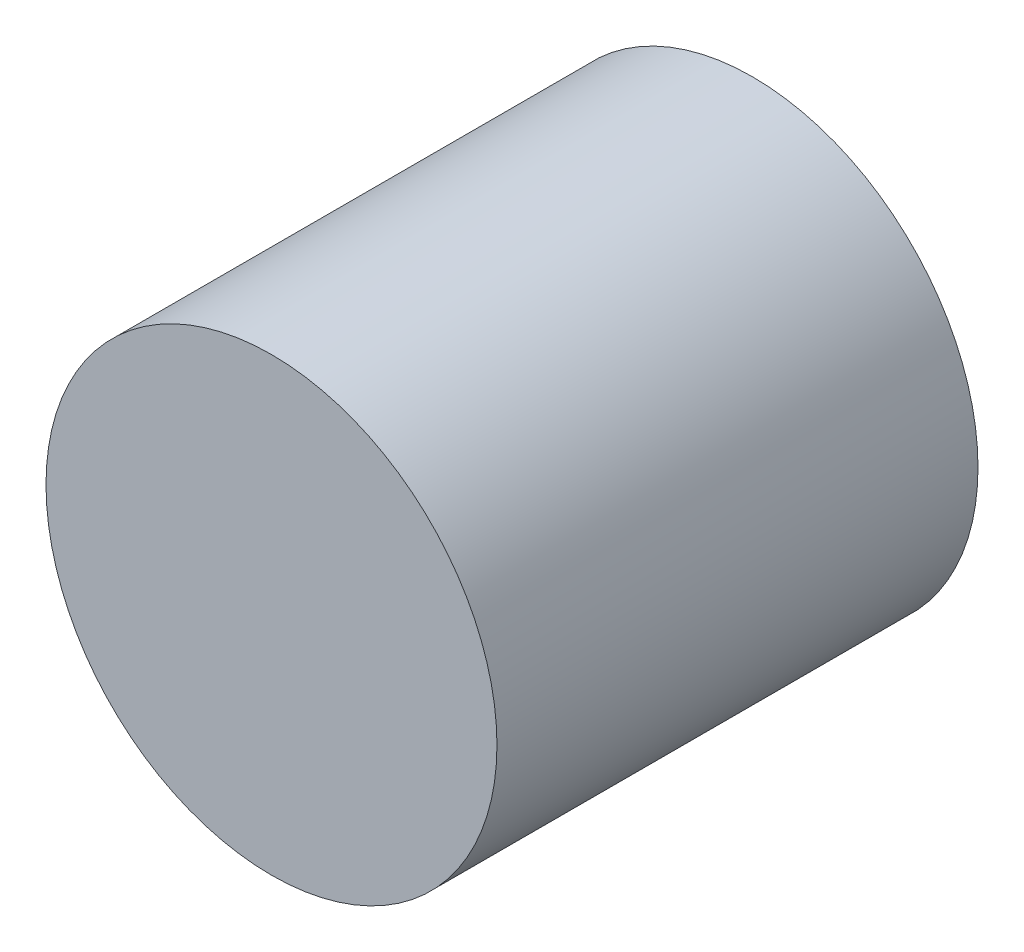
ISO-10303-21;
HEADER;
FILE_DESCRIPTION(('STEP AP214'),'2;1');
FILE_NAME('part.step','',(''),(''),'','','');
FILE_SCHEMA(('AUTOMOTIVE_DESIGN { 1 0 10303 214 1 1 1 1 }'));
ENDSEC;
DATA;
#1=APPLICATION_CONTEXT('core data for automotive mechanical design processes');
#2=APPLICATION_PROTOCOL_DEFINITION('international standard','automotive_design',2000,#1);
#3=PRODUCT_CONTEXT('',#1,'mechanical');
#4=PRODUCT('Part','Part','',(#3));
#5=PRODUCT_RELATED_PRODUCT_CATEGORY('part','',(#4));
#6=PRODUCT_DEFINITION_FORMATION('','',#4);
#7=PRODUCT_DEFINITION_CONTEXT('part definition',#1,'design');
#8=PRODUCT_DEFINITION('design','',#6,#7);
#9=PRODUCT_DEFINITION_SHAPE('','',#8);
#10=(LENGTH_UNIT() NAMED_UNIT(*) SI_UNIT(.MILLI.,.METRE.));
#11=(NAMED_UNIT(*) PLANE_ANGLE_UNIT() SI_UNIT($,.RADIAN.));
#12=(NAMED_UNIT(*) SI_UNIT($,.STERADIAN.) SOLID_ANGLE_UNIT());
#13=UNCERTAINTY_MEASURE_WITH_UNIT(LENGTH_MEASURE(1.E-05),#10,'distance_accuracy_value','');
#14=(GEOMETRIC_REPRESENTATION_CONTEXT(3) GLOBAL_UNCERTAINTY_ASSIGNED_CONTEXT((#13)) GLOBAL_UNIT_ASSIGNED_CONTEXT((#10,
#11,#12)) REPRESENTATION_CONTEXT('',''));
#15=CARTESIAN_POINT('',(0.,0.,0.));
#16=DIRECTION('',(0.,0.,1.));
#17=DIRECTION('',(1.,0.,0.));
#18=AXIS2_PLACEMENT_3D('',#15,#16,#17);
#19=CARTESIAN_POINT('',(-25.6563317135774,30.,16.));
#20=DIRECTION('',(0.,0.,-1.));
#21=DIRECTION('',(-1.,0.,0.));
#22=AXIS2_PLACEMENT_3D('',#19,#20,#21);
#23=CYLINDRICAL_SURFACE('',#22,7.5);
#24=CARTESIAN_POINT('',(-25.6563317135774,30.,16.));
#25=DIRECTION('',(0.,0.,1.));
#26=DIRECTION('',(1.,0.,0.));
#27=AXIS2_PLACEMENT_3D('',#24,#25,#26);
#28=CIRCLE('',#27,7.5);
#29=CARTESIAN_POINT('',(-18.1563317135774,30.,16.));
#30=VERTEX_POINT('',#29);
#31=EDGE_CURVE('E10',#30,#30,#28,.T.);
#32=ORIENTED_EDGE('',*,*,#31,.F.);
#33=EDGE_LOOP('',(#32));
#34=FACE_BOUND('',#33,.T.);
#35=CARTESIAN_POINT('',(-25.6563317135774,30.,0.));
#36=DIRECTION('',(0.,0.,1.));
#37=DIRECTION('',(1.,0.,0.));
#38=AXIS2_PLACEMENT_3D('',#35,#36,#37);
#39=CIRCLE('',#38,7.5);
#40=CARTESIAN_POINT('',(-18.1563317135774,30.,0.));
#41=VERTEX_POINT('',#40);
#42=EDGE_CURVE('E36',#41,#41,#39,.T.);
#43=ORIENTED_EDGE('',*,*,#42,.T.);
#44=EDGE_LOOP('',(#43));
#45=FACE_BOUND('',#44,.T.);
#46=ADVANCED_FACE('F33',(#34,#45),#23,.T.);
#47=CARTESIAN_POINT('',(-25.6563317135774,30.,16.));
#48=DIRECTION('',(0.,0.,1.));
#49=DIRECTION('',(1.,0.,0.));
#50=AXIS2_PLACEMENT_3D('',#47,#48,#49);
#51=PLANE('',#50);
#52=ORIENTED_EDGE('',*,*,#31,.T.);
#53=EDGE_LOOP('',(#52));
#54=FACE_BOUND('',#53,.T.);
#55=ADVANCED_FACE('F48',(#54),#51,.T.);
#56=CARTESIAN_POINT('',(-25.6563317135774,30.,0.));
#57=DIRECTION('',(0.,0.,1.));
#58=DIRECTION('',(1.,0.,0.));
#59=AXIS2_PLACEMENT_3D('',#56,#57,#58);
#60=PLANE('',#59);
#61=ORIENTED_EDGE('',*,*,#42,.F.);
#62=EDGE_LOOP('',(#61));
#63=FACE_BOUND('',#62,.T.);
#64=ADVANCED_FACE('F46',(#63),#60,.F.);
#65=CLOSED_SHELL('',(#46,#55,#64));
#66=MANIFOLD_SOLID_BREP('B2',#65);
#67=ADVANCED_BREP_SHAPE_REPRESENTATION('',(#18,#66),#14);
#68=SHAPE_DEFINITION_REPRESENTATION(#9,#67);
ENDSEC;
END-ISO-10303-21;
